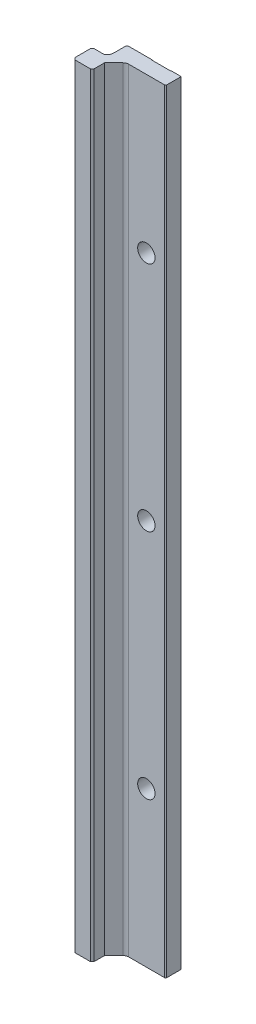
ISO-10303-21;
HEADER;
FILE_DESCRIPTION(('STEP AP214'),'2;1');
FILE_NAME('part.step','',(''),(''),'','','');
FILE_SCHEMA(('AUTOMOTIVE_DESIGN { 1 0 10303 214 1 1 1 1 }'));
ENDSEC;
DATA;
#1=APPLICATION_CONTEXT('core data for automotive mechanical design processes');
#2=APPLICATION_PROTOCOL_DEFINITION('international standard','automotive_design',2000,#1);
#3=PRODUCT_CONTEXT('',#1,'mechanical');
#4=PRODUCT('Part','Part','',(#3));
#5=PRODUCT_RELATED_PRODUCT_CATEGORY('part','',(#4));
#6=PRODUCT_DEFINITION_FORMATION('','',#4);
#7=PRODUCT_DEFINITION_CONTEXT('part definition',#1,'design');
#8=PRODUCT_DEFINITION('design','',#6,#7);
#9=PRODUCT_DEFINITION_SHAPE('','',#8);
#10=(LENGTH_UNIT() NAMED_UNIT(*) SI_UNIT(.MILLI.,.METRE.));
#11=(NAMED_UNIT(*) PLANE_ANGLE_UNIT() SI_UNIT($,.RADIAN.));
#12=(NAMED_UNIT(*) SI_UNIT($,.STERADIAN.) SOLID_ANGLE_UNIT());
#13=UNCERTAINTY_MEASURE_WITH_UNIT(LENGTH_MEASURE(1.E-05),#10,'distance_accuracy_value','');
#14=(GEOMETRIC_REPRESENTATION_CONTEXT(3) GLOBAL_UNCERTAINTY_ASSIGNED_CONTEXT((#13)) GLOBAL_UNIT_ASSIGNED_CONTEXT((#10,
#11,#12)) REPRESENTATION_CONTEXT('',''));
#15=CARTESIAN_POINT('',(0.,0.,0.));
#16=DIRECTION('',(0.,0.,1.));
#17=DIRECTION('',(1.,0.,0.));
#18=AXIS2_PLACEMENT_3D('',#15,#16,#17);
#19=CARTESIAN_POINT('',(-13.25,0.,9.75));
#20=DIRECTION('',(0.707106781186548,0.,0.707106781186548));
#21=DIRECTION('',(0.707106781186548,0.,-0.707106781186548));
#22=AXIS2_PLACEMENT_3D('',#19,#20,#21);
#23=PLANE('',#22);
#24=DIRECTION('',(0.707106781186548,0.,-0.707106781186548));
#25=VECTOR('',#24,1.);
#26=CARTESIAN_POINT('',(-13.25,0.,9.75));
#27=LINE('',#26,#25);
#28=CARTESIAN_POINT('',(-13.5,0.,10.));
#29=VERTEX_POINT('',#28);
#30=CARTESIAN_POINT('',(-13.,0.,9.5));
#31=VERTEX_POINT('',#30);
#32=EDGE_CURVE('E241',#29,#31,#27,.T.);
#33=ORIENTED_EDGE('',*,*,#32,.T.);
#34=DIRECTION('',(0.,1.,0.));
#35=VECTOR('',#34,1.);
#36=CARTESIAN_POINT('',(-13.,0.,9.5));
#37=LINE('',#36,#35);
#38=CARTESIAN_POINT('',(-13.,200.,9.5));
#39=VERTEX_POINT('',#38);
#40=EDGE_CURVE('E269',#39,#31,#37,.F.);
#41=ORIENTED_EDGE('',*,*,#40,.F.);
#42=DIRECTION('',(0.707106781186548,0.,-0.707106781186548));
#43=VECTOR('',#42,1.);
#44=CARTESIAN_POINT('',(-13.25,200.,9.75));
#45=LINE('',#44,#43);
#46=CARTESIAN_POINT('',(-13.5,200.,10.));
#47=VERTEX_POINT('',#46);
#48=EDGE_CURVE('E238',#39,#47,#45,.F.);
#49=ORIENTED_EDGE('',*,*,#48,.T.);
#50=DIRECTION('',(0.,1.,0.));
#51=VECTOR('',#50,1.);
#52=CARTESIAN_POINT('',(-13.5,0.,10.));
#53=LINE('',#52,#51);
#54=EDGE_CURVE('E314',#29,#47,#53,.T.);
#55=ORIENTED_EDGE('',*,*,#54,.F.);
#56=EDGE_LOOP('',(#33,#41,#49,#55));
#57=FACE_BOUND('',#56,.T.);
#58=ADVANCED_FACE('F16',(#57),#23,.T.);
#59=CARTESIAN_POINT('',(-17.75,0.,9.75));
#60=DIRECTION('',(-0.707106781186548,0.,0.707106781186548));
#61=DIRECTION('',(0.707106781186548,0.,0.707106781186548));
#62=AXIS2_PLACEMENT_3D('',#59,#60,#61);
#63=PLANE('',#62);
#64=DIRECTION('',(0.707106781186548,0.,0.707106781186548));
#65=VECTOR('',#64,1.);
#66=CARTESIAN_POINT('',(-17.75,0.,9.75));
#67=LINE('',#66,#65);
#68=CARTESIAN_POINT('',(-18.,0.,9.5));
#69=VERTEX_POINT('',#68);
#70=CARTESIAN_POINT('',(-17.5,0.,10.));
#71=VERTEX_POINT('',#70);
#72=EDGE_CURVE('E202',#69,#71,#67,.T.);
#73=ORIENTED_EDGE('',*,*,#72,.T.);
#74=DIRECTION('',(0.,1.,0.));
#75=VECTOR('',#74,1.);
#76=CARTESIAN_POINT('',(-17.5,0.,10.));
#77=LINE('',#76,#75);
#78=CARTESIAN_POINT('',(-17.5,200.,10.));
#79=VERTEX_POINT('',#78);
#80=EDGE_CURVE('E303',#79,#71,#77,.F.);
#81=ORIENTED_EDGE('',*,*,#80,.F.);
#82=DIRECTION('',(0.707106781186548,0.,0.707106781186548));
#83=VECTOR('',#82,1.);
#84=CARTESIAN_POINT('',(-17.75,200.,9.75));
#85=LINE('',#84,#83);
#86=CARTESIAN_POINT('',(-18.,200.,9.5));
#87=VERTEX_POINT('',#86);
#88=EDGE_CURVE('E244',#79,#87,#85,.F.);
#89=ORIENTED_EDGE('',*,*,#88,.T.);
#90=DIRECTION('',(0.,1.,0.));
#91=VECTOR('',#90,1.);
#92=CARTESIAN_POINT('',(-18.,0.,9.5));
#93=LINE('',#92,#91);
#94=EDGE_CURVE('E197',#69,#87,#93,.T.);
#95=ORIENTED_EDGE('',*,*,#94,.F.);
#96=EDGE_LOOP('',(#73,#81,#89,#95));
#97=FACE_BOUND('',#96,.T.);
#98=ADVANCED_FACE('F678',(#97),#63,.T.);
#99=CARTESIAN_POINT('',(-14.693,0.,4.893));
#100=DIRECTION('',(-0.707106781186548,0.,-0.707106781186548));
#101=DIRECTION('',(-0.707106781186548,0.,0.707106781186548));
#102=AXIS2_PLACEMENT_3D('',#99,#100,#101);
#103=PLANE('',#102);
#104=DIRECTION('',(-0.707106781186548,0.,0.707106781186548));
#105=VECTOR('',#104,1.);
#106=CARTESIAN_POINT('',(-14.693,0.,4.893));
#107=LINE('',#106,#105);
#108=CARTESIAN_POINT('',(-14.5859999999821,0.,4.7860000000179));
#109=VERTEX_POINT('',#108);
#110=CARTESIAN_POINT('',(-14.8,0.,5.));
#111=VERTEX_POINT('',#110);
#112=EDGE_CURVE('E117',#109,#111,#107,.T.);
#113=ORIENTED_EDGE('',*,*,#112,.T.);
#114=DIRECTION('',(0.,1.,0.));
#115=VECTOR('',#114,1.);
#116=CARTESIAN_POINT('',(-14.8,0.,5.));
#117=LINE('',#116,#115);
#118=CARTESIAN_POINT('',(-14.8,200.,5.));
#119=VERTEX_POINT('',#118);
#120=EDGE_CURVE('E194',#119,#111,#117,.F.);
#121=ORIENTED_EDGE('',*,*,#120,.F.);
#122=DIRECTION('',(-0.707106781186548,0.,0.707106781186548));
#123=VECTOR('',#122,1.);
#124=CARTESIAN_POINT('',(-14.693,200.,4.893));
#125=LINE('',#124,#123);
#126=CARTESIAN_POINT('',(-14.5859999999821,200.,4.7860000000179));
#127=VERTEX_POINT('',#126);
#128=EDGE_CURVE('E130',#119,#127,#125,.F.);
#129=ORIENTED_EDGE('',*,*,#128,.T.);
#130=DIRECTION('',(0.,1.,0.));
#131=VECTOR('',#130,1.);
#132=CARTESIAN_POINT('',(-14.5859999999642,0.,4.7860000000358));
#133=LINE('',#132,#131);
#134=EDGE_CURVE('E133',#127,#109,#133,.F.);
#135=ORIENTED_EDGE('',*,*,#134,.T.);
#136=EDGE_LOOP('',(#113,#121,#129,#135));
#137=FACE_BOUND('',#136,.T.);
#138=ADVANCED_FACE('F134',(#137),#103,.T.);
#139=CARTESIAN_POINT('',(-17.75,0.,5.25));
#140=DIRECTION('',(-0.707106781186548,0.,-0.707106781186548));
#141=DIRECTION('',(-0.707106781186548,0.,0.707106781186548));
#142=AXIS2_PLACEMENT_3D('',#139,#140,#141);
#143=PLANE('',#142);
#144=DIRECTION('',(-0.707106781186548,0.,0.707106781186548));
#145=VECTOR('',#144,1.);
#146=CARTESIAN_POINT('',(-17.75,0.,5.25));
#147=LINE('',#146,#145);
#148=CARTESIAN_POINT('',(-17.5,0.,5.));
#149=VERTEX_POINT('',#148);
#150=CARTESIAN_POINT('',(-18.,0.,5.5));
#151=VERTEX_POINT('',#150);
#152=EDGE_CURVE('E137',#149,#151,#147,.T.);
#153=ORIENTED_EDGE('',*,*,#152,.T.);
#154=DIRECTION('',(0.,1.,0.));
#155=VECTOR('',#154,1.);
#156=CARTESIAN_POINT('',(-18.,0.,5.5));
#157=LINE('',#156,#155);
#158=CARTESIAN_POINT('',(-18.,200.,5.5));
#159=VERTEX_POINT('',#158);
#160=EDGE_CURVE('E317',#159,#151,#157,.F.);
#161=ORIENTED_EDGE('',*,*,#160,.F.);
#162=DIRECTION('',(-0.707106781186548,0.,0.707106781186548));
#163=VECTOR('',#162,1.);
#164=CARTESIAN_POINT('',(-17.75,200.,5.25));
#165=LINE('',#164,#163);
#166=CARTESIAN_POINT('',(-17.5,200.,5.));
#167=VERTEX_POINT('',#166);
#168=EDGE_CURVE('E129',#159,#167,#165,.F.);
#169=ORIENTED_EDGE('',*,*,#168,.T.);
#170=DIRECTION('',(0.,1.,0.));
#171=VECTOR('',#170,1.);
#172=CARTESIAN_POINT('',(-17.5,0.,5.));
#173=LINE('',#172,#171);
#174=EDGE_CURVE('E196',#149,#167,#173,.T.);
#175=ORIENTED_EDGE('',*,*,#174,.F.);
#176=EDGE_LOOP('',(#153,#161,#169,#175));
#177=FACE_BOUND('',#176,.T.);
#178=ADVANCED_FACE('F662',(#177),#143,.T.);
#179=CARTESIAN_POINT('',(-16.0014041407,0.,3.37099092899999));
#180=DIRECTION('',(0.,1.,0.));
#181=DIRECTION('',(0.,0.,1.));
#182=AXIS2_PLACEMENT_3D('',#179,#180,#181);
#183=CYLINDRICAL_SURFACE('',#182,2.00140439510003);
#184=DIRECTION('',(0.,1.,0.));
#185=VECTOR('',#184,1.);
#186=CARTESIAN_POINT('',(-14.,0.,3.37200000003222));
#187=LINE('',#186,#185);
#188=CARTESIAN_POINT('',(-13.9999999999887,0.,3.37200000003222));
#189=VERTEX_POINT('',#188);
#190=CARTESIAN_POINT('',(-13.9999999999887,200.,3.37200000003222));
#191=VERTEX_POINT('',#190);
#192=EDGE_CURVE('E141',#189,#191,#187,.T.);
#193=ORIENTED_EDGE('',*,*,#192,.F.);
#194=CARTESIAN_POINT('',(-16.0014041407,0.,3.37099092899999));
#195=DIRECTION('',(0.,1.,0.));
#196=DIRECTION('',(0.,0.,1.));
#197=AXIS2_PLACEMENT_3D('',#194,#195,#196);
#198=CIRCLE('',#197,2.00140439510003);
#199=EDGE_CURVE('E19',#109,#189,#198,.T.);
#200=ORIENTED_EDGE('',*,*,#199,.F.);
#201=ORIENTED_EDGE('',*,*,#134,.F.);
#202=CARTESIAN_POINT('',(-16.0014041407,200.,3.37099092899999));
#203=DIRECTION('',(0.,1.,0.));
#204=DIRECTION('',(0.,0.,1.));
#205=AXIS2_PLACEMENT_3D('',#202,#203,#204);
#206=CIRCLE('',#205,2.00140439510003);
#207=EDGE_CURVE('E143',#191,#127,#206,.F.);
#208=ORIENTED_EDGE('',*,*,#207,.F.);
#209=EDGE_LOOP('',(#193,#200,#201,#208));
#210=FACE_BOUND('',#209,.T.);
#211=ADVANCED_FACE('F139',(#210),#183,.F.);
#212=CARTESIAN_POINT('',(-13.85,0.,0.15));
#213=DIRECTION('',(-0.707106781186547,0.,-0.707106781186548));
#214=DIRECTION('',(-0.707106781186548,0.,0.707106781186547));
#215=AXIS2_PLACEMENT_3D('',#212,#213,#214);
#216=PLANE('',#215);
#217=DIRECTION('',(-0.707106781186548,0.,0.707106781186547));
#218=VECTOR('',#217,1.);
#219=CARTESIAN_POINT('',(-13.85,0.,0.15));
#220=LINE('',#219,#218);
#221=CARTESIAN_POINT('',(-13.7,0.,0.));
#222=VERTEX_POINT('',#221);
#223=CARTESIAN_POINT('',(-13.9999999999925,0.,0.2999999999925));
#224=VERTEX_POINT('',#223);
#225=EDGE_CURVE('E147',#222,#224,#220,.T.);
#226=ORIENTED_EDGE('',*,*,#225,.T.);
#227=DIRECTION('',(0.,1.,0.));
#228=VECTOR('',#227,1.);
#229=CARTESIAN_POINT('',(-14.,0.,0.3));
#230=LINE('',#229,#228);
#231=CARTESIAN_POINT('',(-13.9999999999925,200.,0.2999999999925));
#232=VERTEX_POINT('',#231);
#233=EDGE_CURVE('E324',#232,#224,#230,.F.);
#234=ORIENTED_EDGE('',*,*,#233,.F.);
#235=DIRECTION('',(-0.707106781186548,0.,0.707106781186547));
#236=VECTOR('',#235,1.);
#237=CARTESIAN_POINT('',(-13.85,200.,0.15));
#238=LINE('',#237,#236);
#239=CARTESIAN_POINT('',(-13.7,200.,0.));
#240=VERTEX_POINT('',#239);
#241=EDGE_CURVE('E144',#232,#240,#238,.F.);
#242=ORIENTED_EDGE('',*,*,#241,.T.);
#243=DIRECTION('',(0.,1.,0.));
#244=VECTOR('',#243,1.);
#245=CARTESIAN_POINT('',(-13.7,0.,0.));
#246=LINE('',#245,#244);
#247=EDGE_CURVE('E218',#222,#240,#246,.T.);
#248=ORIENTED_EDGE('',*,*,#247,.F.);
#249=EDGE_LOOP('',(#226,#234,#242,#248));
#250=FACE_BOUND('',#249,.T.);
#251=ADVANCED_FACE('F390',(#250),#216,.T.);
#252=CARTESIAN_POINT('',(-7.45,0.,0.05));
#253=DIRECTION('',(0.707106781186549,0.,-0.707106781186546));
#254=DIRECTION('',(-0.707106781186546,0.,-0.707106781186549));
#255=AXIS2_PLACEMENT_3D('',#252,#253,#254);
#256=PLANE('',#255);
#257=DIRECTION('',(-0.707106781186546,0.,-0.707106781186549));
#258=VECTOR('',#257,1.);
#259=CARTESIAN_POINT('',(-7.45,0.,0.05));
#260=LINE('',#259,#258);
#261=CARTESIAN_POINT('',(-7.4,0.,0.0999999999999999));
#262=VERTEX_POINT('',#261);
#263=CARTESIAN_POINT('',(-7.5,0.,0.));
#264=VERTEX_POINT('',#263);
#265=EDGE_CURVE('E261',#262,#264,#260,.T.);
#266=ORIENTED_EDGE('',*,*,#265,.T.);
#267=DIRECTION('',(0.,1.,0.));
#268=VECTOR('',#267,1.);
#269=CARTESIAN_POINT('',(-7.5,0.,0.));
#270=LINE('',#269,#268);
#271=CARTESIAN_POINT('',(-7.5,200.,0.));
#272=VERTEX_POINT('',#271);
#273=EDGE_CURVE('E222',#272,#264,#270,.F.);
#274=ORIENTED_EDGE('',*,*,#273,.F.);
#275=DIRECTION('',(-0.707106781186546,0.,-0.707106781186549));
#276=VECTOR('',#275,1.);
#277=CARTESIAN_POINT('',(-7.45,200.,0.05));
#278=LINE('',#277,#276);
#279=CARTESIAN_POINT('',(-7.4,200.,0.0999999999999999));
#280=VERTEX_POINT('',#279);
#281=EDGE_CURVE('E256',#272,#280,#278,.F.);
#282=ORIENTED_EDGE('',*,*,#281,.T.);
#283=DIRECTION('',(0.,1.,0.));
#284=VECTOR('',#283,1.);
#285=CARTESIAN_POINT('',(-7.4,0.,0.1));
#286=LINE('',#285,#284);
#287=EDGE_CURVE('E237',#262,#280,#286,.T.);
#288=ORIENTED_EDGE('',*,*,#287,.F.);
#289=EDGE_LOOP('',(#266,#274,#282,#288));
#290=FACE_BOUND('',#289,.T.);
#291=ADVANCED_FACE('F468',(#290),#256,.T.);
#292=CARTESIAN_POINT('',(-2.55,0.,0.0499999999999999));
#293=DIRECTION('',(-0.707106781186547,0.,-0.707106781186548));
#294=DIRECTION('',(-0.707106781186548,0.,0.707106781186547));
#295=AXIS2_PLACEMENT_3D('',#292,#293,#294);
#296=PLANE('',#295);
#297=DIRECTION('',(-0.707106781186548,0.,0.707106781186547));
#298=VECTOR('',#297,1.);
#299=CARTESIAN_POINT('',(-2.55,0.,0.0499999999999999));
#300=LINE('',#299,#298);
#301=CARTESIAN_POINT('',(-2.5,0.,0.));
#302=VERTEX_POINT('',#301);
#303=CARTESIAN_POINT('',(-2.6,0.,0.1));
#304=VERTEX_POINT('',#303);
#305=EDGE_CURVE('E267',#302,#304,#300,.T.);
#306=ORIENTED_EDGE('',*,*,#305,.T.);
#307=DIRECTION('',(0.,1.,0.));
#308=VECTOR('',#307,1.);
#309=CARTESIAN_POINT('',(-2.6,0.,0.1));
#310=LINE('',#309,#308);
#311=CARTESIAN_POINT('',(-2.6,200.,0.1));
#312=VERTEX_POINT('',#311);
#313=EDGE_CURVE('E221',#312,#304,#310,.F.);
#314=ORIENTED_EDGE('',*,*,#313,.F.);
#315=DIRECTION('',(-0.707106781186548,0.,0.707106781186547));
#316=VECTOR('',#315,1.);
#317=CARTESIAN_POINT('',(-2.55,200.,0.0499999999999999));
#318=LINE('',#317,#316);
#319=CARTESIAN_POINT('',(-2.5,200.,0.));
#320=VERTEX_POINT('',#319);
#321=EDGE_CURVE('E264',#312,#320,#318,.F.);
#322=ORIENTED_EDGE('',*,*,#321,.T.);
#323=DIRECTION('',(0.,1.,0.));
#324=VECTOR('',#323,1.);
#325=CARTESIAN_POINT('',(-2.5,0.,0.));
#326=LINE('',#325,#324);
#327=EDGE_CURVE('E281',#302,#320,#326,.T.);
#328=ORIENTED_EDGE('',*,*,#327,.F.);
#329=EDGE_LOOP('',(#306,#314,#322,#328));
#330=FACE_BOUND('',#329,.T.);
#331=ADVANCED_FACE('F463',(#330),#296,.T.);
#332=CARTESIAN_POINT('',(-11.8200000000058,0.,5.62000000000579));
#333=DIRECTION('',(0.707106781186548,0.,0.707106781186548));
#334=DIRECTION('',(0.707106781186548,0.,-0.707106781186548));
#335=AXIS2_PLACEMENT_3D('',#332,#333,#334);
#336=PLANE('',#335);
#337=DIRECTION('',(-0.707106781180669,0.,0.707106781192426));
#338=VECTOR('',#337,1.);
#339=CARTESIAN_POINT('',(-10.6400000000312,0.,4.43999999999196));
#340=LINE('',#339,#338);
#341=CARTESIAN_POINT('',(-10.6400000000312,0.,4.43999999999197));
#342=VERTEX_POINT('',#341);
#343=CARTESIAN_POINT('',(-13.,0.,6.8));
#344=VERTEX_POINT('',#343);
#345=EDGE_CURVE('E168',#342,#344,#340,.T.);
#346=ORIENTED_EDGE('',*,*,#345,.F.);
#347=DIRECTION('',(0.,1.,0.));
#348=VECTOR('',#347,1.);
#349=CARTESIAN_POINT('',(-10.6400000000312,0.,4.43999999999197));
#350=LINE('',#349,#348);
#351=CARTESIAN_POINT('',(-10.6400000000312,200.,4.43999999999196));
#352=VERTEX_POINT('',#351);
#353=EDGE_CURVE('E164',#342,#352,#350,.T.);
#354=ORIENTED_EDGE('',*,*,#353,.T.);
#355=DIRECTION('',(-0.707106781180669,0.,0.707106781192426));
#356=VECTOR('',#355,1.);
#357=CARTESIAN_POINT('',(-10.6400000000312,200.,4.43999999999196));
#358=LINE('',#357,#356);
#359=CARTESIAN_POINT('',(-13.,200.,6.8));
#360=VERTEX_POINT('',#359);
#361=EDGE_CURVE('E160',#352,#360,#358,.T.);
#362=ORIENTED_EDGE('',*,*,#361,.T.);
#363=DIRECTION('',(0.,1.,0.));
#364=VECTOR('',#363,1.);
#365=CARTESIAN_POINT('',(-13.,0.,6.8));
#366=LINE('',#365,#364);
#367=EDGE_CURVE('E300',#344,#360,#366,.T.);
#368=ORIENTED_EDGE('',*,*,#367,.F.);
#369=EDGE_LOOP('',(#346,#354,#362,#368));
#370=FACE_BOUND('',#369,.T.);
#371=ADVANCED_FACE('F440',(#370),#336,.T.);
#372=CARTESIAN_POINT('',(-13.,0.,8.15));
#373=DIRECTION('',(1.,0.,0.));
#374=DIRECTION('',(0.,0.,-1.));
#375=AXIS2_PLACEMENT_3D('',#372,#373,#374);
#376=PLANE('',#375);
#377=DIRECTION('',(0.,0.,-1.));
#378=VECTOR('',#377,1.);
#379=CARTESIAN_POINT('',(-13.,0.,3.92465596411553));
#380=LINE('',#379,#378);
#381=EDGE_CURVE('E306',#344,#31,#380,.F.);
#382=ORIENTED_EDGE('',*,*,#381,.F.);
#383=ORIENTED_EDGE('',*,*,#367,.T.);
#384=DIRECTION('',(0.,0.,-1.));
#385=VECTOR('',#384,1.);
#386=CARTESIAN_POINT('',(-13.,200.,3.92465596411553));
#387=LINE('',#386,#385);
#388=EDGE_CURVE('E275',#360,#39,#387,.F.);
#389=ORIENTED_EDGE('',*,*,#388,.T.);
#390=ORIENTED_EDGE('',*,*,#40,.T.);
#391=EDGE_LOOP('',(#382,#383,#389,#390));
#392=FACE_BOUND('',#391,.T.);
#393=ADVANCED_FACE('F437',(#392),#376,.T.);
#394=CARTESIAN_POINT('',(-15.5,0.,10.));
#395=DIRECTION('',(0.,0.,1.));
#396=DIRECTION('',(1.,0.,0.));
#397=AXIS2_PLACEMENT_3D('',#394,#395,#396);
#398=PLANE('',#397);
#399=DIRECTION('',(1.,0.,0.));
#400=VECTOR('',#399,1.);
#401=CARTESIAN_POINT('',(-9.76708959135916,0.,10.));
#402=LINE('',#401,#400);
#403=EDGE_CURVE('E309',#29,#71,#402,.F.);
#404=ORIENTED_EDGE('',*,*,#403,.F.);
#405=ORIENTED_EDGE('',*,*,#54,.T.);
#406=DIRECTION('',(1.,0.,0.));
#407=VECTOR('',#406,1.);
#408=CARTESIAN_POINT('',(-9.76708959135916,200.,10.));
#409=LINE('',#408,#407);
#410=EDGE_CURVE('E278',#47,#79,#409,.F.);
#411=ORIENTED_EDGE('',*,*,#410,.T.);
#412=ORIENTED_EDGE('',*,*,#80,.T.);
#413=EDGE_LOOP('',(#404,#405,#411,#412));
#414=FACE_BOUND('',#413,.T.);
#415=ADVANCED_FACE('F520',(#414),#398,.T.);
#416=CARTESIAN_POINT('',(-18.,0.,7.5));
#417=DIRECTION('',(-1.,0.,0.));
#418=DIRECTION('',(0.,0.,1.));
#419=AXIS2_PLACEMENT_3D('',#416,#417,#418);
#420=PLANE('',#419);
#421=DIRECTION('',(0.,0.,-1.));
#422=VECTOR('',#421,1.);
#423=CARTESIAN_POINT('',(-18.,0.,3.92465596411553));
#424=LINE('',#423,#422);
#425=EDGE_CURVE('E191',#69,#151,#424,.T.);
#426=ORIENTED_EDGE('',*,*,#425,.F.);
#427=ORIENTED_EDGE('',*,*,#94,.T.);
#428=DIRECTION('',(0.,0.,-1.));
#429=VECTOR('',#428,1.);
#430=CARTESIAN_POINT('',(-18.,200.,3.92465596411553));
#431=LINE('',#430,#429);
#432=EDGE_CURVE('E186',#87,#159,#431,.T.);
#433=ORIENTED_EDGE('',*,*,#432,.T.);
#434=ORIENTED_EDGE('',*,*,#160,.T.);
#435=EDGE_LOOP('',(#426,#427,#433,#434));
#436=FACE_BOUND('',#435,.T.);
#437=ADVANCED_FACE('F516',(#436),#420,.T.);
#438=CARTESIAN_POINT('',(-16.15,0.,5.));
#439=DIRECTION('',(0.,0.,-1.));
#440=DIRECTION('',(-1.,0.,0.));
#441=AXIS2_PLACEMENT_3D('',#438,#439,#440);
#442=PLANE('',#441);
#443=DIRECTION('',(1.,0.,0.));
#444=VECTOR('',#443,1.);
#445=CARTESIAN_POINT('',(-9.76708959135916,0.,5.));
#446=LINE('',#445,#444);
#447=EDGE_CURVE('E125',#149,#111,#446,.T.);
#448=ORIENTED_EDGE('',*,*,#447,.F.);
#449=ORIENTED_EDGE('',*,*,#174,.T.);
#450=DIRECTION('',(1.,0.,0.));
#451=VECTOR('',#450,1.);
#452=CARTESIAN_POINT('',(-9.76708959135916,200.,5.));
#453=LINE('',#452,#451);
#454=EDGE_CURVE('E182',#167,#119,#453,.T.);
#455=ORIENTED_EDGE('',*,*,#454,.T.);
#456=ORIENTED_EDGE('',*,*,#120,.T.);
#457=EDGE_LOOP('',(#448,#449,#455,#456));
#458=FACE_BOUND('',#457,.T.);
#459=ADVANCED_FACE('F513',(#458),#442,.T.);
#460=CARTESIAN_POINT('',(-14.,0.,1.83600000001611));
#461=DIRECTION('',(-1.,0.,0.));
#462=DIRECTION('',(0.,0.,1.));
#463=AXIS2_PLACEMENT_3D('',#460,#461,#462);
#464=PLANE('',#463);
#465=DIRECTION('',(0.,0.,-1.));
#466=VECTOR('',#465,1.);
#467=CARTESIAN_POINT('',(-13.9999999999775,0.,3.92465596411553));
#468=LINE('',#467,#466);
#469=EDGE_CURVE('E190',#189,#224,#468,.T.);
#470=ORIENTED_EDGE('',*,*,#469,.F.);
#471=ORIENTED_EDGE('',*,*,#192,.T.);
#472=DIRECTION('',(0.,0.,-1.));
#473=VECTOR('',#472,1.);
#474=CARTESIAN_POINT('',(-13.9999999999775,200.,3.92465596411553));
#475=LINE('',#474,#473);
#476=EDGE_CURVE('E185',#191,#232,#475,.T.);
#477=ORIENTED_EDGE('',*,*,#476,.T.);
#478=ORIENTED_EDGE('',*,*,#233,.T.);
#479=EDGE_LOOP('',(#470,#471,#477,#478));
#480=FACE_BOUND('',#479,.T.);
#481=ADVANCED_FACE('F387',(#480),#464,.T.);
#482=CARTESIAN_POINT('',(-10.6,0.,0.));
#483=DIRECTION('',(0.,0.,-1.));
#484=DIRECTION('',(-1.,0.,0.));
#485=AXIS2_PLACEMENT_3D('',#482,#483,#484);
#486=PLANE('',#485);
#487=DIRECTION('',(1.,0.,0.));
#488=VECTOR('',#487,1.);
#489=CARTESIAN_POINT('',(-9.76708959135916,0.,0.));
#490=LINE('',#489,#488);
#491=EDGE_CURVE('E212',#222,#264,#490,.T.);
#492=ORIENTED_EDGE('',*,*,#491,.F.);
#493=ORIENTED_EDGE('',*,*,#247,.T.);
#494=DIRECTION('',(1.,0.,0.));
#495=VECTOR('',#494,1.);
#496=CARTESIAN_POINT('',(-9.76708959135916,200.,0.));
#497=LINE('',#496,#495);
#498=EDGE_CURVE('E206',#240,#272,#497,.T.);
#499=ORIENTED_EDGE('',*,*,#498,.T.);
#500=ORIENTED_EDGE('',*,*,#273,.T.);
#501=EDGE_LOOP('',(#492,#493,#499,#500));
#502=FACE_BOUND('',#501,.T.);
#503=ADVANCED_FACE('F394',(#502),#486,.T.);
#504=CARTESIAN_POINT('',(-5.,0.,0.1));
#505=DIRECTION('',(0.,0.,-1.));
#506=DIRECTION('',(-1.,0.,0.));
#507=AXIS2_PLACEMENT_3D('',#504,#505,#506);
#508=PLANE('',#507);
#509=DIRECTION('',(1.,0.,0.));
#510=VECTOR('',#509,1.);
#511=CARTESIAN_POINT('',(-9.76708959135916,0.,0.0999999999999998));
#512=LINE('',#511,#510);
#513=EDGE_CURVE('E215',#262,#304,#512,.T.);
#514=ORIENTED_EDGE('',*,*,#513,.F.);
#515=ORIENTED_EDGE('',*,*,#287,.T.);
#516=DIRECTION('',(1.,0.,0.));
#517=VECTOR('',#516,1.);
#518=CARTESIAN_POINT('',(-9.76708959135916,200.,0.0999999999999998));
#519=LINE('',#518,#517);
#520=EDGE_CURVE('E209',#280,#312,#519,.T.);
#521=ORIENTED_EDGE('',*,*,#520,.T.);
#522=ORIENTED_EDGE('',*,*,#313,.T.);
#523=EDGE_LOOP('',(#514,#515,#521,#522));
#524=FACE_BOUND('',#523,.T.);
#525=CARTESIAN_POINT('',(-5.,40.,0.0999999999999998));
#526=DIRECTION('',(0.,0.,1.));
#527=DIRECTION('',(1.,0.,0.));
#528=AXIS2_PLACEMENT_3D('',#525,#526,#527);
#529=CIRCLE('',#528,2.25);
#530=CARTESIAN_POINT('',(-2.75,40.,0.0999999999999998));
#531=VERTEX_POINT('',#530);
#532=EDGE_CURVE('E157',#531,#531,#529,.T.);
#533=ORIENTED_EDGE('',*,*,#532,.T.);
#534=EDGE_LOOP('',(#533));
#535=FACE_BOUND('',#534,.T.);
#536=CARTESIAN_POINT('',(-5.,100.,0.0999999999999998));
#537=DIRECTION('',(0.,0.,1.));
#538=DIRECTION('',(1.,0.,0.));
#539=AXIS2_PLACEMENT_3D('',#536,#537,#538);
#540=CIRCLE('',#539,2.25);
#541=CARTESIAN_POINT('',(-2.75,100.,0.0999999999999998));
#542=VERTEX_POINT('',#541);
#543=EDGE_CURVE('E153',#542,#542,#540,.T.);
#544=ORIENTED_EDGE('',*,*,#543,.T.);
#545=EDGE_LOOP('',(#544));
#546=FACE_BOUND('',#545,.T.);
#547=CARTESIAN_POINT('',(-5.,160.,0.0999999999999998));
#548=DIRECTION('',(0.,0.,1.));
#549=DIRECTION('',(1.,0.,0.));
#550=AXIS2_PLACEMENT_3D('',#547,#548,#549);
#551=CIRCLE('',#550,2.25);
#552=CARTESIAN_POINT('',(-2.75,160.,0.0999999999999998));
#553=VERTEX_POINT('',#552);
#554=EDGE_CURVE('E150',#553,#553,#551,.T.);
#555=ORIENTED_EDGE('',*,*,#554,.T.);
#556=EDGE_LOOP('',(#555));
#557=FACE_BOUND('',#556,.T.);
#558=ADVANCED_FACE('F466',(#524,#535,#546,#557),#508,.T.);
#559=CARTESIAN_POINT('',(-1.25,0.,0.));
#560=DIRECTION('',(0.,0.,-1.));
#561=DIRECTION('',(-1.,0.,0.));
#562=AXIS2_PLACEMENT_3D('',#559,#560,#561);
#563=PLANE('',#562);
#564=DIRECTION('',(1.,0.,0.));
#565=VECTOR('',#564,1.);
#566=CARTESIAN_POINT('',(-9.76708959135916,0.,0.));
#567=LINE('',#566,#565);
#568=CARTESIAN_POINT('',(0.,0.,0.));
#569=VERTEX_POINT('',#568);
#570=EDGE_CURVE('E232',#302,#569,#567,.T.);
#571=ORIENTED_EDGE('',*,*,#570,.F.);
#572=ORIENTED_EDGE('',*,*,#327,.T.);
#573=DIRECTION('',(1.,0.,0.));
#574=VECTOR('',#573,1.);
#575=CARTESIAN_POINT('',(-9.76708959135916,200.,0.));
#576=LINE('',#575,#574);
#577=CARTESIAN_POINT('',(0.,200.,0.));
#578=VERTEX_POINT('',#577);
#579=EDGE_CURVE('E227',#320,#578,#576,.T.);
#580=ORIENTED_EDGE('',*,*,#579,.T.);
#581=DIRECTION('',(0.,1.,0.));
#582=VECTOR('',#581,1.);
#583=CARTESIAN_POINT('',(0.,0.,0.));
#584=LINE('',#583,#582);
#585=EDGE_CURVE('E154',#569,#578,#584,.T.);
#586=ORIENTED_EDGE('',*,*,#585,.F.);
#587=EDGE_LOOP('',(#571,#572,#580,#586));
#588=FACE_BOUND('',#587,.T.);
#589=ADVANCED_FACE('F460',(#588),#563,.T.);
#590=CARTESIAN_POINT('',(0.,0.,1.9275));
#591=DIRECTION('',(1.,0.,0.));
#592=DIRECTION('',(0.,0.,-1.));
#593=AXIS2_PLACEMENT_3D('',#590,#591,#592);
#594=PLANE('',#593);
#595=DIRECTION('',(0.,0.,-1.));
#596=VECTOR('',#595,1.);
#597=CARTESIAN_POINT('',(0.,0.,3.92465596411553));
#598=LINE('',#597,#596);
#599=CARTESIAN_POINT('',(0.,0.,3.855));
#600=VERTEX_POINT('',#599);
#601=EDGE_CURVE('E163',#569,#600,#598,.F.);
#602=ORIENTED_EDGE('',*,*,#601,.F.);
#603=ORIENTED_EDGE('',*,*,#585,.T.);
#604=DIRECTION('',(0.,0.,-1.));
#605=VECTOR('',#604,1.);
#606=CARTESIAN_POINT('',(0.,200.,3.92465596411553));
#607=LINE('',#606,#605);
#608=CARTESIAN_POINT('',(0.,200.,3.855));
#609=VERTEX_POINT('',#608);
#610=EDGE_CURVE('E287',#578,#609,#607,.F.);
#611=ORIENTED_EDGE('',*,*,#610,.T.);
#612=DIRECTION('',(0.,1.,0.));
#613=VECTOR('',#612,1.);
#614=CARTESIAN_POINT('',(0.,0.,3.855));
#615=LINE('',#614,#613);
#616=EDGE_CURVE('E173',#600,#609,#615,.T.);
#617=ORIENTED_EDGE('',*,*,#616,.F.);
#618=EDGE_LOOP('',(#602,#603,#611,#617));
#619=FACE_BOUND('',#618,.T.);
#620=ADVANCED_FACE('F454',(#619),#594,.T.);
#621=CARTESIAN_POINT('',(-5.,160.,2.1));
#622=DIRECTION('',(0.,0.,1.));
#623=DIRECTION('',(1.,0.,0.));
#624=AXIS2_PLACEMENT_3D('',#621,#622,#623);
#625=CYLINDRICAL_SURFACE('',#624,2.25);
#626=ORIENTED_EDGE('',*,*,#554,.F.);
#627=EDGE_LOOP('',(#626));
#628=FACE_BOUND('',#627,.T.);
#629=CARTESIAN_POINT('',(-5.,160.,4.));
#630=DIRECTION('',(0.,0.,1.));
#631=DIRECTION('',(1.,0.,0.));
#632=AXIS2_PLACEMENT_3D('',#629,#630,#631);
#633=CIRCLE('',#632,2.25);
#634=CARTESIAN_POINT('',(-2.75,160.,4.));
#635=VERTEX_POINT('',#634);
#636=EDGE_CURVE('E169',#635,#635,#633,.F.);
#637=ORIENTED_EDGE('',*,*,#636,.F.);
#638=EDGE_LOOP('',(#637));
#639=FACE_BOUND('',#638,.T.);
#640=ADVANCED_FACE('F498',(#628,#639),#625,.F.);
#641=CARTESIAN_POINT('',(-5.,100.,2.1));
#642=DIRECTION('',(0.,0.,1.));
#643=DIRECTION('',(1.,0.,0.));
#644=AXIS2_PLACEMENT_3D('',#641,#642,#643);
#645=CYLINDRICAL_SURFACE('',#644,2.25);
#646=ORIENTED_EDGE('',*,*,#543,.F.);
#647=EDGE_LOOP('',(#646));
#648=FACE_BOUND('',#647,.T.);
#649=CARTESIAN_POINT('',(-5.,100.,4.));
#650=DIRECTION('',(0.,0.,1.));
#651=DIRECTION('',(1.,0.,0.));
#652=AXIS2_PLACEMENT_3D('',#649,#650,#651);
#653=CIRCLE('',#652,2.25);
#654=CARTESIAN_POINT('',(-2.75,100.,4.));
#655=VERTEX_POINT('',#654);
#656=EDGE_CURVE('E172',#655,#655,#653,.F.);
#657=ORIENTED_EDGE('',*,*,#656,.F.);
#658=EDGE_LOOP('',(#657));
#659=FACE_BOUND('',#658,.T.);
#660=ADVANCED_FACE('F494',(#648,#659),#645,.F.);
#661=CARTESIAN_POINT('',(-5.,40.,2.1));
#662=DIRECTION('',(0.,0.,1.));
#663=DIRECTION('',(1.,0.,0.));
#664=AXIS2_PLACEMENT_3D('',#661,#662,#663);
#665=CYLINDRICAL_SURFACE('',#664,2.25);
#666=ORIENTED_EDGE('',*,*,#532,.F.);
#667=EDGE_LOOP('',(#666));
#668=FACE_BOUND('',#667,.T.);
#669=CARTESIAN_POINT('',(-5.,40.,4.));
#670=DIRECTION('',(0.,0.,1.));
#671=DIRECTION('',(1.,0.,0.));
#672=AXIS2_PLACEMENT_3D('',#669,#670,#671);
#673=CIRCLE('',#672,2.25);
#674=CARTESIAN_POINT('',(-2.75,40.,4.));
#675=VERTEX_POINT('',#674);
#676=EDGE_CURVE('E176',#675,#675,#673,.F.);
#677=ORIENTED_EDGE('',*,*,#676,.F.);
#678=EDGE_LOOP('',(#677));
#679=FACE_BOUND('',#678,.T.);
#680=ADVANCED_FACE('F491',(#668,#679),#665,.F.);
#681=CARTESIAN_POINT('',(-9.76708959135916,200.,3.92465596411553));
#682=DIRECTION('',(0.,-1.,0.));
#683=DIRECTION('',(0.,0.,-1.));
#684=AXIS2_PLACEMENT_3D('',#681,#682,#683);
#685=PLANE('',#684);
#686=ORIENTED_EDGE('',*,*,#610,.F.);
#687=ORIENTED_EDGE('',*,*,#579,.F.);
#688=ORIENTED_EDGE('',*,*,#321,.F.);
#689=ORIENTED_EDGE('',*,*,#520,.F.);
#690=ORIENTED_EDGE('',*,*,#281,.F.);
#691=ORIENTED_EDGE('',*,*,#498,.F.);
#692=ORIENTED_EDGE('',*,*,#241,.F.);
#693=ORIENTED_EDGE('',*,*,#476,.F.);
#694=ORIENTED_EDGE('',*,*,#207,.T.);
#695=ORIENTED_EDGE('',*,*,#128,.F.);
#696=ORIENTED_EDGE('',*,*,#454,.F.);
#697=ORIENTED_EDGE('',*,*,#168,.F.);
#698=ORIENTED_EDGE('',*,*,#432,.F.);
#699=ORIENTED_EDGE('',*,*,#88,.F.);
#700=ORIENTED_EDGE('',*,*,#410,.F.);
#701=ORIENTED_EDGE('',*,*,#48,.F.);
#702=ORIENTED_EDGE('',*,*,#388,.F.);
#703=ORIENTED_EDGE('',*,*,#361,.F.);
#704=CARTESIAN_POINT('',(-9.5812152553,200.,5.49389052139999));
#705=DIRECTION('',(0.,1.,0.));
#706=DIRECTION('',(0.,0.,1.));
#707=AXIS2_PLACEMENT_3D('',#704,#705,#706);
#708=CIRCLE('',#707,1.49389101569999);
#709=CARTESIAN_POINT('',(-9.58,200.,3.9999999999975));
#710=VERTEX_POINT('',#709);
#711=EDGE_CURVE('E161',#352,#710,#708,.F.);
#712=ORIENTED_EDGE('',*,*,#711,.T.);
#713=DIRECTION('',(1.,0.,0.));
#714=VECTOR('',#713,1.);
#715=CARTESIAN_POINT('',(-4.915,200.,4.));
#716=LINE('',#715,#714);
#717=CARTESIAN_POINT('',(-0.25,200.,4.));
#718=VERTEX_POINT('',#717);
#719=EDGE_CURVE('E179',#718,#710,#716,.F.);
#720=ORIENTED_EDGE('',*,*,#719,.F.);
#721=DIRECTION('',(0.865031189261803,0.,-0.501718089771846));
#722=VECTOR('',#721,1.);
#723=CARTESIAN_POINT('',(-0.125,200.,3.9275));
#724=LINE('',#723,#722);
#725=EDGE_CURVE('E292',#609,#718,#724,.F.);
#726=ORIENTED_EDGE('',*,*,#725,.F.);
#727=EDGE_LOOP('',(#686,#687,#688,#689,#690,#691,#692,#693,#694,#695,#696,#697,#698,#699,#700,
#701,#702,#703,#712,#720,#726));
#728=FACE_BOUND('',#727,.T.);
#729=ADVANCED_FACE('F433',(#728),#685,.F.);
#730=CARTESIAN_POINT('',(-9.5812152553,0.,5.49389052139999));
#731=DIRECTION('',(0.,1.,0.));
#732=DIRECTION('',(0.,0.,1.));
#733=AXIS2_PLACEMENT_3D('',#730,#731,#732);
#734=CYLINDRICAL_SURFACE('',#733,1.49389101569999);
#735=ORIENTED_EDGE('',*,*,#353,.F.);
#736=CARTESIAN_POINT('',(-9.5812152553,0.,5.49389052139999));
#737=DIRECTION('',(0.,1.,0.));
#738=DIRECTION('',(0.,0.,1.));
#739=AXIS2_PLACEMENT_3D('',#736,#737,#738);
#740=CIRCLE('',#739,1.49389101569999);
#741=CARTESIAN_POINT('',(-9.58,0.,3.9999999999975));
#742=VERTEX_POINT('',#741);
#743=EDGE_CURVE('E165',#742,#342,#740,.T.);
#744=ORIENTED_EDGE('',*,*,#743,.F.);
#745=DIRECTION('',(0.,1.,0.));
#746=VECTOR('',#745,1.);
#747=CARTESIAN_POINT('',(-9.58,0.,4.));
#748=LINE('',#747,#746);
#749=EDGE_CURVE('E363',#710,#742,#748,.F.);
#750=ORIENTED_EDGE('',*,*,#749,.F.);
#751=ORIENTED_EDGE('',*,*,#711,.F.);
#752=EDGE_LOOP('',(#735,#744,#750,#751));
#753=FACE_BOUND('',#752,.T.);
#754=ADVANCED_FACE('F444',(#753),#734,.F.);
#755=CARTESIAN_POINT('',(-9.76708959135916,0.,3.92465596411553));
#756=DIRECTION('',(0.,-1.,0.));
#757=DIRECTION('',(0.,0.,-1.));
#758=AXIS2_PLACEMENT_3D('',#755,#756,#757);
#759=PLANE('',#758);
#760=ORIENTED_EDGE('',*,*,#305,.F.);
#761=ORIENTED_EDGE('',*,*,#570,.T.);
#762=ORIENTED_EDGE('',*,*,#601,.T.);
#763=DIRECTION('',(0.865031189261803,0.,-0.501718089771846));
#764=VECTOR('',#763,1.);
#765=CARTESIAN_POINT('',(-0.125,0.,3.9275));
#766=LINE('',#765,#764);
#767=CARTESIAN_POINT('',(-0.25,0.,4.));
#768=VERTEX_POINT('',#767);
#769=EDGE_CURVE('E34',#768,#600,#766,.T.);
#770=ORIENTED_EDGE('',*,*,#769,.F.);
#771=DIRECTION('',(1.,0.,0.));
#772=VECTOR('',#771,1.);
#773=CARTESIAN_POINT('',(-4.915,0.,4.));
#774=LINE('',#773,#772);
#775=EDGE_CURVE('E25',#742,#768,#774,.T.);
#776=ORIENTED_EDGE('',*,*,#775,.F.);
#777=ORIENTED_EDGE('',*,*,#743,.T.);
#778=ORIENTED_EDGE('',*,*,#345,.T.);
#779=ORIENTED_EDGE('',*,*,#381,.T.);
#780=ORIENTED_EDGE('',*,*,#32,.F.);
#781=ORIENTED_EDGE('',*,*,#403,.T.);
#782=ORIENTED_EDGE('',*,*,#72,.F.);
#783=ORIENTED_EDGE('',*,*,#425,.T.);
#784=ORIENTED_EDGE('',*,*,#152,.F.);
#785=ORIENTED_EDGE('',*,*,#447,.T.);
#786=ORIENTED_EDGE('',*,*,#112,.F.);
#787=ORIENTED_EDGE('',*,*,#199,.T.);
#788=ORIENTED_EDGE('',*,*,#469,.T.);
#789=ORIENTED_EDGE('',*,*,#225,.F.);
#790=ORIENTED_EDGE('',*,*,#491,.T.);
#791=ORIENTED_EDGE('',*,*,#265,.F.);
#792=ORIENTED_EDGE('',*,*,#513,.T.);
#793=EDGE_LOOP('',(#760,#761,#762,#770,#776,#777,#778,#779,#780,#781,#782,#783,#784,#785,#786,
#787,#788,#789,#790,#791,#792));
#794=FACE_BOUND('',#793,.T.);
#795=ADVANCED_FACE('F119',(#794),#759,.T.);
#796=CARTESIAN_POINT('',(-0.125,0.,3.9275));
#797=DIRECTION('',(0.501718089771846,0.,0.865031189261803));
#798=DIRECTION('',(0.865031189261803,0.,-0.501718089771846));
#799=AXIS2_PLACEMENT_3D('',#796,#797,#798);
#800=PLANE('',#799);
#801=ORIENTED_EDGE('',*,*,#769,.T.);
#802=ORIENTED_EDGE('',*,*,#616,.T.);
#803=ORIENTED_EDGE('',*,*,#725,.T.);
#804=DIRECTION('',(0.,1.,0.));
#805=VECTOR('',#804,1.);
#806=CARTESIAN_POINT('',(-0.25,0.,4.));
#807=LINE('',#806,#805);
#808=EDGE_CURVE('E10',#768,#718,#807,.T.);
#809=ORIENTED_EDGE('',*,*,#808,.F.);
#810=EDGE_LOOP('',(#801,#802,#803,#809));
#811=FACE_BOUND('',#810,.T.);
#812=ADVANCED_FACE('F450',(#811),#800,.T.);
#813=CARTESIAN_POINT('',(-4.915,0.,4.));
#814=DIRECTION('',(0.,0.,1.));
#815=DIRECTION('',(1.,0.,0.));
#816=AXIS2_PLACEMENT_3D('',#813,#814,#815);
#817=PLANE('',#816);
#818=ORIENTED_EDGE('',*,*,#775,.T.);
#819=ORIENTED_EDGE('',*,*,#808,.T.);
#820=ORIENTED_EDGE('',*,*,#719,.T.);
#821=ORIENTED_EDGE('',*,*,#749,.T.);
#822=EDGE_LOOP('',(#818,#819,#820,#821));
#823=FACE_BOUND('',#822,.T.);
#824=ORIENTED_EDGE('',*,*,#676,.T.);
#825=EDGE_LOOP('',(#824));
#826=FACE_BOUND('',#825,.T.);
#827=ORIENTED_EDGE('',*,*,#656,.T.);
#828=EDGE_LOOP('',(#827));
#829=FACE_BOUND('',#828,.T.);
#830=ORIENTED_EDGE('',*,*,#636,.T.);
#831=EDGE_LOOP('',(#830));
#832=FACE_BOUND('',#831,.T.);
#833=ADVANCED_FACE('F446',(#823,#826,#829,#832),#817,.T.);
#834=CLOSED_SHELL('',(#58,#98,#138,#178,#211,#251,#291,#331,#371,#393,#415,#437,#459,#481,#503,
#558,#589,#620,#640,#660,#680,#729,#754,#795,#812,#833));
#835=MANIFOLD_SOLID_BREP('B1',#834);
#836=ADVANCED_BREP_SHAPE_REPRESENTATION('',(#18,#835),#14);
#837=SHAPE_DEFINITION_REPRESENTATION(#9,#836);
ENDSEC;
END-ISO-10303-21;
